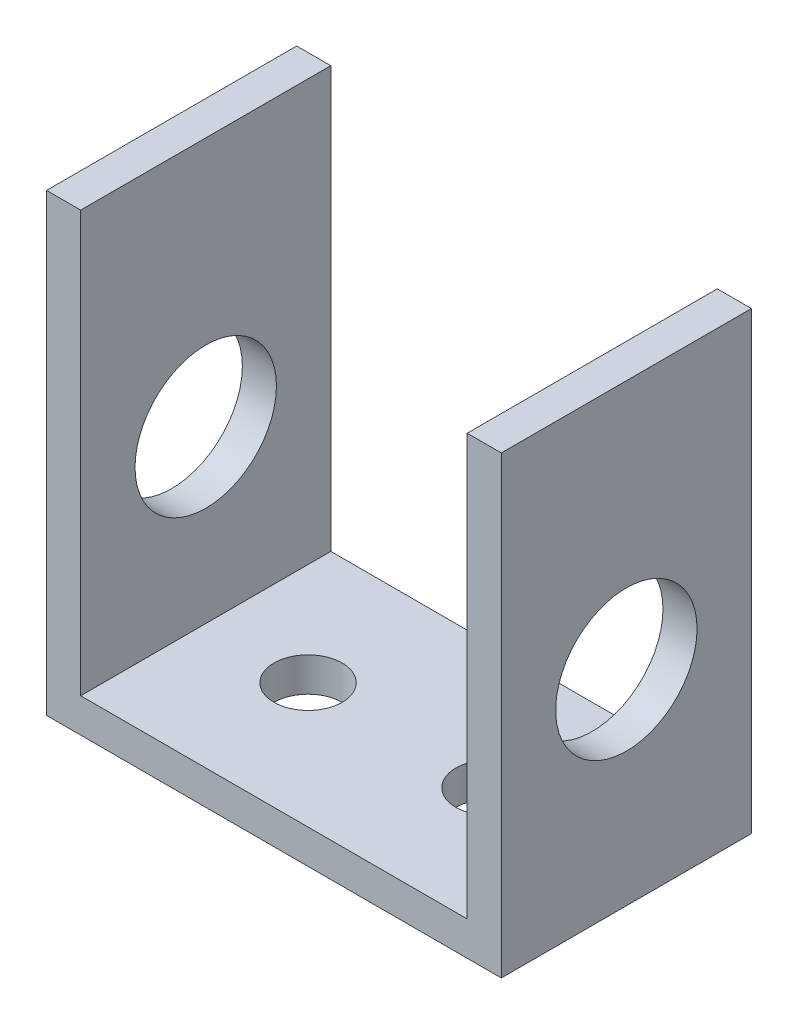
ISO-10303-21;
HEADER;
FILE_DESCRIPTION(('STEP AP214'),'2;1');
FILE_NAME('part.step','',(''),(''),'','','');
FILE_SCHEMA(('AUTOMOTIVE_DESIGN { 1 0 10303 214 1 1 1 1 }'));
ENDSEC;
DATA;
#1=APPLICATION_CONTEXT('core data for automotive mechanical design processes');
#2=APPLICATION_PROTOCOL_DEFINITION('international standard','automotive_design',2000,#1);
#3=PRODUCT_CONTEXT('',#1,'mechanical');
#4=PRODUCT('Part','Part','',(#3));
#5=PRODUCT_RELATED_PRODUCT_CATEGORY('part','',(#4));
#6=PRODUCT_DEFINITION_FORMATION('','',#4);
#7=PRODUCT_DEFINITION_CONTEXT('part definition',#1,'design');
#8=PRODUCT_DEFINITION('design','',#6,#7);
#9=PRODUCT_DEFINITION_SHAPE('','',#8);
#10=(LENGTH_UNIT() NAMED_UNIT(*) SI_UNIT(.MILLI.,.METRE.));
#11=(NAMED_UNIT(*) PLANE_ANGLE_UNIT() SI_UNIT($,.RADIAN.));
#12=(NAMED_UNIT(*) SI_UNIT($,.STERADIAN.) SOLID_ANGLE_UNIT());
#13=UNCERTAINTY_MEASURE_WITH_UNIT(LENGTH_MEASURE(1.E-05),#10,'distance_accuracy_value','');
#14=(GEOMETRIC_REPRESENTATION_CONTEXT(3) GLOBAL_UNCERTAINTY_ASSIGNED_CONTEXT((#13)) GLOBAL_UNIT_ASSIGNED_CONTEXT((#10,
#11,#12)) REPRESENTATION_CONTEXT('',''));
#15=CARTESIAN_POINT('',(0.,0.,0.));
#16=DIRECTION('',(0.,0.,1.));
#17=DIRECTION('',(1.,0.,0.));
#18=AXIS2_PLACEMENT_3D('',#15,#16,#17);
#19=CARTESIAN_POINT('',(-11.0947878242615,13.3137453891138,11.));
#20=DIRECTION('',(0.,-1.,0.));
#21=DIRECTION('',(0.,0.,-1.));
#22=AXIS2_PLACEMENT_3D('',#19,#20,#21);
#23=PLANE('',#22);
#24=DIRECTION('',(-1.,0.,0.));
#25=VECTOR('',#24,1.);
#26=CARTESIAN_POINT('',(-11.0947878242615,13.3137453891138,0.));
#27=LINE('',#26,#25);
#28=CARTESIAN_POINT('',(-9.59478782426151,13.3137453891138,0.));
#29=VERTEX_POINT('',#28);
#30=CARTESIAN_POINT('',(-11.0947878242615,13.3137453891138,0.));
#31=VERTEX_POINT('',#30);
#32=EDGE_CURVE('E127',#29,#31,#27,.T.);
#33=ORIENTED_EDGE('',*,*,#32,.T.);
#34=DIRECTION('',(0.,0.,-1.));
#35=VECTOR('',#34,1.);
#36=CARTESIAN_POINT('',(-11.0947878242615,13.3137453891138,11.));
#37=LINE('',#36,#35);
#38=CARTESIAN_POINT('',(-11.0947878242615,13.3137453891138,11.));
#39=VERTEX_POINT('',#38);
#40=EDGE_CURVE('E11',#39,#31,#37,.T.);
#41=ORIENTED_EDGE('',*,*,#40,.F.);
#42=DIRECTION('',(-1.,0.,0.));
#43=VECTOR('',#42,1.);
#44=CARTESIAN_POINT('',(-11.0947878242615,13.3137453891138,11.));
#45=LINE('',#44,#43);
#46=CARTESIAN_POINT('',(-9.59478782426151,13.3137453891138,11.));
#47=VERTEX_POINT('',#46);
#48=EDGE_CURVE('E142',#47,#39,#45,.T.);
#49=ORIENTED_EDGE('',*,*,#48,.F.);
#50=DIRECTION('',(0.,0.,-1.));
#51=VECTOR('',#50,1.);
#52=CARTESIAN_POINT('',(-9.59478782426151,13.3137453891138,11.));
#53=LINE('',#52,#51);
#54=EDGE_CURVE('E123',#47,#29,#53,.T.);
#55=ORIENTED_EDGE('',*,*,#54,.T.);
#56=EDGE_LOOP('',(#33,#41,#49,#55));
#57=FACE_BOUND('',#56,.T.);
#58=ADVANCED_FACE('F30',(#57),#23,.F.);
#59=CARTESIAN_POINT('',(-11.0947878242615,-6.68625461088619,11.));
#60=DIRECTION('',(1.,0.,0.));
#61=DIRECTION('',(0.,0.,-1.));
#62=AXIS2_PLACEMENT_3D('',#59,#60,#61);
#63=PLANE('',#62);
#64=CARTESIAN_POINT('',(-11.0947878242615,2.31374538911381,5.5));
#65=DIRECTION('',(1.,0.,0.));
#66=DIRECTION('',(0.,0.,-1.));
#67=AXIS2_PLACEMENT_3D('',#64,#65,#66);
#68=CIRCLE('',#67,3.11);
#69=CARTESIAN_POINT('',(-11.0947878242615,2.31374538911381,2.39));
#70=VERTEX_POINT('',#69);
#71=EDGE_CURVE('E181',#70,#70,#68,.T.);
#72=ORIENTED_EDGE('',*,*,#71,.T.);
#73=EDGE_LOOP('',(#72));
#74=FACE_BOUND('',#73,.T.);
#75=DIRECTION('',(0.,-1.,0.));
#76=VECTOR('',#75,1.);
#77=CARTESIAN_POINT('',(-11.0947878242615,-6.68625461088619,0.));
#78=LINE('',#77,#76);
#79=CARTESIAN_POINT('',(-11.0947878242615,-6.68625461088619,0.));
#80=VERTEX_POINT('',#79);
#81=EDGE_CURVE('E130',#31,#80,#78,.T.);
#82=ORIENTED_EDGE('',*,*,#81,.T.);
#83=DIRECTION('',(0.,0.,-1.));
#84=VECTOR('',#83,1.);
#85=CARTESIAN_POINT('',(-11.0947878242615,-6.68625461088619,11.));
#86=LINE('',#85,#84);
#87=CARTESIAN_POINT('',(-11.0947878242615,-6.68625461088619,11.));
#88=VERTEX_POINT('',#87);
#89=EDGE_CURVE('E39',#88,#80,#86,.T.);
#90=ORIENTED_EDGE('',*,*,#89,.F.);
#91=DIRECTION('',(0.,-1.,0.));
#92=VECTOR('',#91,1.);
#93=CARTESIAN_POINT('',(-11.0947878242615,-6.68625461088619,11.));
#94=LINE('',#93,#92);
#95=EDGE_CURVE('E90',#39,#88,#94,.T.);
#96=ORIENTED_EDGE('',*,*,#95,.F.);
#97=ORIENTED_EDGE('',*,*,#40,.T.);
#98=EDGE_LOOP('',(#82,#90,#96,#97));
#99=FACE_BOUND('',#98,.T.);
#100=ADVANCED_FACE('F214',(#74,#99),#63,.F.);
#101=CARTESIAN_POINT('',(-11.0947878242615,-6.68625461088619,11.));
#102=DIRECTION('',(0.,1.,0.));
#103=DIRECTION('',(0.,0.,1.));
#104=AXIS2_PLACEMENT_3D('',#101,#102,#103);
#105=PLANE('',#104);
#106=CARTESIAN_POINT('',(2.90521217573849,-6.68625461088619,5.5));
#107=DIRECTION('',(0.,1.,0.));
#108=DIRECTION('',(0.,0.,1.));
#109=AXIS2_PLACEMENT_3D('',#106,#107,#108);
#110=CIRCLE('',#109,1.5);
#111=CARTESIAN_POINT('',(2.90521217573849,-6.68625461088619,7.));
#112=VERTEX_POINT('',#111);
#113=EDGE_CURVE('E190',#112,#112,#110,.T.);
#114=ORIENTED_EDGE('',*,*,#113,.T.);
#115=EDGE_LOOP('',(#114));
#116=FACE_BOUND('',#115,.T.);
#117=CARTESIAN_POINT('',(-5.09478782426151,-6.68625461088619,5.5));
#118=DIRECTION('',(0.,1.,0.));
#119=DIRECTION('',(0.,0.,1.));
#120=AXIS2_PLACEMENT_3D('',#117,#118,#119);
#121=CIRCLE('',#120,1.5);
#122=CARTESIAN_POINT('',(-5.09478782426151,-6.68625461088619,7.));
#123=VERTEX_POINT('',#122);
#124=EDGE_CURVE('E182',#123,#123,#121,.T.);
#125=ORIENTED_EDGE('',*,*,#124,.T.);
#126=EDGE_LOOP('',(#125));
#127=FACE_BOUND('',#126,.T.);
#128=DIRECTION('',(1.,0.,0.));
#129=VECTOR('',#128,1.);
#130=CARTESIAN_POINT('',(-11.0947878242615,-6.68625461088619,0.));
#131=LINE('',#130,#129);
#132=CARTESIAN_POINT('',(8.90521217573849,-6.68625461088619,0.));
#133=VERTEX_POINT('',#132);
#134=EDGE_CURVE('E133',#80,#133,#131,.T.);
#135=ORIENTED_EDGE('',*,*,#134,.T.);
#136=DIRECTION('',(0.,0.,-1.));
#137=VECTOR('',#136,1.);
#138=CARTESIAN_POINT('',(8.90521217573849,-6.68625461088619,11.));
#139=LINE('',#138,#137);
#140=CARTESIAN_POINT('',(8.90521217573849,-6.68625461088619,11.));
#141=VERTEX_POINT('',#140);
#142=EDGE_CURVE('E149',#141,#133,#139,.T.);
#143=ORIENTED_EDGE('',*,*,#142,.F.);
#144=DIRECTION('',(1.,0.,0.));
#145=VECTOR('',#144,1.);
#146=CARTESIAN_POINT('',(-11.0947878242615,-6.68625461088619,11.));
#147=LINE('',#146,#145);
#148=EDGE_CURVE('E158',#88,#141,#147,.T.);
#149=ORIENTED_EDGE('',*,*,#148,.F.);
#150=ORIENTED_EDGE('',*,*,#89,.T.);
#151=EDGE_LOOP('',(#135,#143,#149,#150));
#152=FACE_BOUND('',#151,.T.);
#153=ADVANCED_FACE('F156',(#116,#127,#152),#105,.F.);
#154=CARTESIAN_POINT('',(8.90521217573849,-6.68625461088619,11.));
#155=DIRECTION('',(-1.,0.,0.));
#156=DIRECTION('',(0.,0.,1.));
#157=AXIS2_PLACEMENT_3D('',#154,#155,#156);
#158=PLANE('',#157);
#159=CARTESIAN_POINT('',(8.90521217573849,2.31374538911381,5.5));
#160=DIRECTION('',(1.,0.,0.));
#161=DIRECTION('',(0.,0.,-1.));
#162=AXIS2_PLACEMENT_3D('',#159,#160,#161);
#163=CIRCLE('',#162,3.11);
#164=CARTESIAN_POINT('',(8.90521217573849,2.31374538911381,2.39));
#165=VERTEX_POINT('',#164);
#166=EDGE_CURVE('E178',#165,#165,#163,.T.);
#167=ORIENTED_EDGE('',*,*,#166,.F.);
#168=EDGE_LOOP('',(#167));
#169=FACE_BOUND('',#168,.T.);
#170=DIRECTION('',(0.,1.,0.));
#171=VECTOR('',#170,1.);
#172=CARTESIAN_POINT('',(8.90521217573849,-6.68625461088619,0.));
#173=LINE('',#172,#171);
#174=CARTESIAN_POINT('',(8.90521217573849,13.3137453891138,0.));
#175=VERTEX_POINT('',#174);
#176=EDGE_CURVE('E135',#133,#175,#173,.T.);
#177=ORIENTED_EDGE('',*,*,#176,.T.);
#178=DIRECTION('',(0.,0.,-1.));
#179=VECTOR('',#178,1.);
#180=CARTESIAN_POINT('',(8.90521217573849,13.3137453891138,11.));
#181=LINE('',#180,#179);
#182=CARTESIAN_POINT('',(8.90521217573849,13.3137453891138,11.));
#183=VERTEX_POINT('',#182);
#184=EDGE_CURVE('E146',#183,#175,#181,.T.);
#185=ORIENTED_EDGE('',*,*,#184,.F.);
#186=DIRECTION('',(0.,1.,0.));
#187=VECTOR('',#186,1.);
#188=CARTESIAN_POINT('',(8.90521217573849,-6.68625461088619,11.));
#189=LINE('',#188,#187);
#190=EDGE_CURVE('E170',#141,#183,#189,.T.);
#191=ORIENTED_EDGE('',*,*,#190,.F.);
#192=ORIENTED_EDGE('',*,*,#142,.T.);
#193=EDGE_LOOP('',(#177,#185,#191,#192));
#194=FACE_BOUND('',#193,.T.);
#195=ADVANCED_FACE('F166',(#169,#194),#158,.F.);
#196=CARTESIAN_POINT('',(8.90521217573849,13.3137453891138,11.));
#197=DIRECTION('',(0.,-1.,0.));
#198=DIRECTION('',(0.,0.,-1.));
#199=AXIS2_PLACEMENT_3D('',#196,#197,#198);
#200=PLANE('',#199);
#201=DIRECTION('',(-1.,0.,0.));
#202=VECTOR('',#201,1.);
#203=CARTESIAN_POINT('',(8.90521217573849,13.3137453891138,0.));
#204=LINE('',#203,#202);
#205=CARTESIAN_POINT('',(7.40521217573849,13.3137453891138,0.));
#206=VERTEX_POINT('',#205);
#207=EDGE_CURVE('E137',#175,#206,#204,.T.);
#208=ORIENTED_EDGE('',*,*,#207,.T.);
#209=DIRECTION('',(0.,0.,-1.));
#210=VECTOR('',#209,1.);
#211=CARTESIAN_POINT('',(7.40521217573849,13.3137453891138,11.));
#212=LINE('',#211,#210);
#213=CARTESIAN_POINT('',(7.40521217573849,13.3137453891138,11.));
#214=VERTEX_POINT('',#213);
#215=EDGE_CURVE('E118',#214,#206,#212,.T.);
#216=ORIENTED_EDGE('',*,*,#215,.F.);
#217=DIRECTION('',(-1.,0.,0.));
#218=VECTOR('',#217,1.);
#219=CARTESIAN_POINT('',(8.90521217573849,13.3137453891138,11.));
#220=LINE('',#219,#218);
#221=EDGE_CURVE('E109',#183,#214,#220,.T.);
#222=ORIENTED_EDGE('',*,*,#221,.F.);
#223=ORIENTED_EDGE('',*,*,#184,.T.);
#224=EDGE_LOOP('',(#208,#216,#222,#223));
#225=FACE_BOUND('',#224,.T.);
#226=ADVANCED_FACE('F169',(#225),#200,.F.);
#227=CARTESIAN_POINT('',(7.40521217573849,13.3137453891138,11.));
#228=DIRECTION('',(1.,0.,0.));
#229=DIRECTION('',(0.,1.,0.));
#230=AXIS2_PLACEMENT_3D('',#227,#228,#229);
#231=PLANE('',#230);
#232=CARTESIAN_POINT('',(7.40521217573849,2.31374538911381,5.5));
#233=DIRECTION('',(1.,0.,0.));
#234=DIRECTION('',(0.,1.,0.));
#235=AXIS2_PLACEMENT_3D('',#232,#233,#234);
#236=CIRCLE('',#235,3.11);
#237=CARTESIAN_POINT('',(7.40521217573849,5.42374538911381,5.5));
#238=VERTEX_POINT('',#237);
#239=EDGE_CURVE('E131',#238,#238,#236,.T.);
#240=ORIENTED_EDGE('',*,*,#239,.T.);
#241=EDGE_LOOP('',(#240));
#242=FACE_BOUND('',#241,.T.);
#243=DIRECTION('',(0.,-1.,0.));
#244=VECTOR('',#243,1.);
#245=CARTESIAN_POINT('',(7.40521217573849,13.3137453891138,0.));
#246=LINE('',#245,#244);
#247=CARTESIAN_POINT('',(7.40521217573849,-5.18625461088619,0.));
#248=VERTEX_POINT('',#247);
#249=EDGE_CURVE('E117',#206,#248,#246,.T.);
#250=ORIENTED_EDGE('',*,*,#249,.T.);
#251=DIRECTION('',(0.,0.,-1.));
#252=VECTOR('',#251,1.);
#253=CARTESIAN_POINT('',(7.40521217573849,-5.18625461088619,11.));
#254=LINE('',#253,#252);
#255=CARTESIAN_POINT('',(7.40521217573849,-5.18625461088619,11.));
#256=VERTEX_POINT('',#255);
#257=EDGE_CURVE('E114',#256,#248,#254,.T.);
#258=ORIENTED_EDGE('',*,*,#257,.F.);
#259=DIRECTION('',(0.,-1.,0.));
#260=VECTOR('',#259,1.);
#261=CARTESIAN_POINT('',(7.40521217573849,13.3137453891138,11.));
#262=LINE('',#261,#260);
#263=EDGE_CURVE('E103',#214,#256,#262,.T.);
#264=ORIENTED_EDGE('',*,*,#263,.F.);
#265=ORIENTED_EDGE('',*,*,#215,.T.);
#266=EDGE_LOOP('',(#250,#258,#264,#265));
#267=FACE_BOUND('',#266,.T.);
#268=ADVANCED_FACE('F115',(#242,#267),#231,.F.);
#269=CARTESIAN_POINT('',(7.40521217573849,-5.18625461088619,11.));
#270=DIRECTION('',(0.,-1.,0.));
#271=DIRECTION('',(1.,0.,0.));
#272=AXIS2_PLACEMENT_3D('',#269,#270,#271);
#273=PLANE('',#272);
#274=CARTESIAN_POINT('',(2.90521217573849,-5.18625461088619,5.5));
#275=DIRECTION('',(0.,1.,0.));
#276=DIRECTION('',(0.,0.,1.));
#277=AXIS2_PLACEMENT_3D('',#274,#275,#276);
#278=CIRCLE('',#277,1.5);
#279=CARTESIAN_POINT('',(2.90521217573849,-5.18625461088619,7.));
#280=VERTEX_POINT('',#279);
#281=EDGE_CURVE('E193',#280,#280,#278,.T.);
#282=ORIENTED_EDGE('',*,*,#281,.F.);
#283=EDGE_LOOP('',(#282));
#284=FACE_BOUND('',#283,.T.);
#285=CARTESIAN_POINT('',(-5.09478782426151,-5.18625461088619,5.5));
#286=DIRECTION('',(0.,1.,0.));
#287=DIRECTION('',(0.,0.,1.));
#288=AXIS2_PLACEMENT_3D('',#285,#286,#287);
#289=CIRCLE('',#288,1.5);
#290=CARTESIAN_POINT('',(-5.09478782426151,-5.18625461088619,7.));
#291=VERTEX_POINT('',#290);
#292=EDGE_CURVE('E187',#291,#291,#289,.T.);
#293=ORIENTED_EDGE('',*,*,#292,.F.);
#294=EDGE_LOOP('',(#293));
#295=FACE_BOUND('',#294,.T.);
#296=DIRECTION('',(-1.,0.,0.));
#297=VECTOR('',#296,1.);
#298=CARTESIAN_POINT('',(7.40521217573849,-5.18625461088619,0.));
#299=LINE('',#298,#297);
#300=CARTESIAN_POINT('',(-9.59478782426151,-5.18625461088619,0.));
#301=VERTEX_POINT('',#300);
#302=EDGE_CURVE('E76',#248,#301,#299,.T.);
#303=ORIENTED_EDGE('',*,*,#302,.T.);
#304=DIRECTION('',(0.,0.,-1.));
#305=VECTOR('',#304,1.);
#306=CARTESIAN_POINT('',(-9.59478782426151,-5.18625461088619,11.));
#307=LINE('',#306,#305);
#308=CARTESIAN_POINT('',(-9.59478782426151,-5.18625461088619,11.));
#309=VERTEX_POINT('',#308);
#310=EDGE_CURVE('E119',#309,#301,#307,.T.);
#311=ORIENTED_EDGE('',*,*,#310,.F.);
#312=DIRECTION('',(-1.,0.,0.));
#313=VECTOR('',#312,1.);
#314=CARTESIAN_POINT('',(7.40521217573849,-5.18625461088619,11.));
#315=LINE('',#314,#313);
#316=EDGE_CURVE('E107',#256,#309,#315,.T.);
#317=ORIENTED_EDGE('',*,*,#316,.F.);
#318=ORIENTED_EDGE('',*,*,#257,.T.);
#319=EDGE_LOOP('',(#303,#311,#317,#318));
#320=FACE_BOUND('',#319,.T.);
#321=ADVANCED_FACE('F121',(#284,#295,#320),#273,.F.);
#322=CARTESIAN_POINT('',(-9.59478782426151,13.3137453891138,11.));
#323=DIRECTION('',(-1.,0.,0.));
#324=DIRECTION('',(0.,0.,1.));
#325=AXIS2_PLACEMENT_3D('',#322,#323,#324);
#326=PLANE('',#325);
#327=CARTESIAN_POINT('',(-9.59478782426151,2.31374538911381,5.5));
#328=DIRECTION('',(-1.,0.,0.));
#329=DIRECTION('',(0.,0.,1.));
#330=AXIS2_PLACEMENT_3D('',#327,#328,#329);
#331=CIRCLE('',#330,3.11);
#332=CARTESIAN_POINT('',(-9.59478782426151,2.31374538911381,8.61));
#333=VERTEX_POINT('',#332);
#334=EDGE_CURVE('E33',#333,#333,#331,.T.);
#335=ORIENTED_EDGE('',*,*,#334,.T.);
#336=EDGE_LOOP('',(#335));
#337=FACE_BOUND('',#336,.T.);
#338=DIRECTION('',(0.,1.,0.));
#339=VECTOR('',#338,1.);
#340=CARTESIAN_POINT('',(-9.59478782426151,13.3137453891138,0.));
#341=LINE('',#340,#339);
#342=EDGE_CURVE('E82',#301,#29,#341,.T.);
#343=ORIENTED_EDGE('',*,*,#342,.T.);
#344=ORIENTED_EDGE('',*,*,#54,.F.);
#345=DIRECTION('',(0.,1.,0.));
#346=VECTOR('',#345,1.);
#347=CARTESIAN_POINT('',(-9.59478782426151,13.3137453891138,11.));
#348=LINE('',#347,#346);
#349=EDGE_CURVE('E47',#309,#47,#348,.T.);
#350=ORIENTED_EDGE('',*,*,#349,.F.);
#351=ORIENTED_EDGE('',*,*,#310,.T.);
#352=EDGE_LOOP('',(#343,#344,#350,#351));
#353=FACE_BOUND('',#352,.T.);
#354=ADVANCED_FACE('F202',(#337,#353),#326,.F.);
#355=CARTESIAN_POINT('',(-9.59478782426151,13.3137453891138,11.));
#356=DIRECTION('',(0.,0.,-1.));
#357=DIRECTION('',(-1.,0.,0.));
#358=AXIS2_PLACEMENT_3D('',#355,#356,#357);
#359=PLANE('',#358);
#360=ORIENTED_EDGE('',*,*,#48,.T.);
#361=ORIENTED_EDGE('',*,*,#95,.T.);
#362=ORIENTED_EDGE('',*,*,#148,.T.);
#363=ORIENTED_EDGE('',*,*,#190,.T.);
#364=ORIENTED_EDGE('',*,*,#221,.T.);
#365=ORIENTED_EDGE('',*,*,#263,.T.);
#366=ORIENTED_EDGE('',*,*,#316,.T.);
#367=ORIENTED_EDGE('',*,*,#349,.T.);
#368=EDGE_LOOP('',(#360,#361,#362,#363,#364,#365,#366,#367));
#369=FACE_BOUND('',#368,.T.);
#370=ADVANCED_FACE('F105',(#369),#359,.F.);
#371=CARTESIAN_POINT('',(-9.59478782426151,13.3137453891138,0.));
#372=DIRECTION('',(0.,0.,-1.));
#373=DIRECTION('',(-1.,0.,0.));
#374=AXIS2_PLACEMENT_3D('',#371,#372,#373);
#375=PLANE('',#374);
#376=ORIENTED_EDGE('',*,*,#32,.F.);
#377=ORIENTED_EDGE('',*,*,#342,.F.);
#378=ORIENTED_EDGE('',*,*,#302,.F.);
#379=ORIENTED_EDGE('',*,*,#249,.F.);
#380=ORIENTED_EDGE('',*,*,#207,.F.);
#381=ORIENTED_EDGE('',*,*,#176,.F.);
#382=ORIENTED_EDGE('',*,*,#134,.F.);
#383=ORIENTED_EDGE('',*,*,#81,.F.);
#384=EDGE_LOOP('',(#376,#377,#378,#379,#380,#381,#382,#383));
#385=FACE_BOUND('',#384,.T.);
#386=ADVANCED_FACE('F162',(#385),#375,.T.);
#387=CARTESIAN_POINT('',(-11.0947878242615,2.31374538911381,5.5));
#388=DIRECTION('',(1.,0.,0.));
#389=DIRECTION('',(0.,0.,-1.));
#390=AXIS2_PLACEMENT_3D('',#387,#388,#389);
#391=CYLINDRICAL_SURFACE('',#390,3.11);
#392=ORIENTED_EDGE('',*,*,#71,.F.);
#393=EDGE_LOOP('',(#392));
#394=FACE_BOUND('',#393,.T.);
#395=ORIENTED_EDGE('',*,*,#334,.F.);
#396=EDGE_LOOP('',(#395));
#397=FACE_BOUND('',#396,.T.);
#398=ADVANCED_FACE('F282',(#394,#397),#391,.F.);
#399=ORIENTED_EDGE('',*,*,#166,.T.);
#400=EDGE_LOOP('',(#399));
#401=FACE_BOUND('',#400,.T.);
#402=ORIENTED_EDGE('',*,*,#239,.F.);
#403=EDGE_LOOP('',(#402));
#404=FACE_BOUND('',#403,.T.);
#405=ADVANCED_FACE('F209',(#401,#404),#391,.F.);
#406=CARTESIAN_POINT('',(-5.09478782426151,-16.1862546108862,5.5));
#407=DIRECTION('',(0.,1.,0.));
#408=DIRECTION('',(0.,0.,1.));
#409=AXIS2_PLACEMENT_3D('',#406,#407,#408);
#410=CYLINDRICAL_SURFACE('',#409,1.5);
#411=ORIENTED_EDGE('',*,*,#292,.T.);
#412=EDGE_LOOP('',(#411));
#413=FACE_BOUND('',#412,.T.);
#414=ORIENTED_EDGE('',*,*,#124,.F.);
#415=EDGE_LOOP('',(#414));
#416=FACE_BOUND('',#415,.T.);
#417=ADVANCED_FACE('F206',(#413,#416),#410,.F.);
#418=CARTESIAN_POINT('',(2.90521217573849,-16.1862546108862,5.5));
#419=DIRECTION('',(0.,1.,0.));
#420=DIRECTION('',(0.,0.,1.));
#421=AXIS2_PLACEMENT_3D('',#418,#419,#420);
#422=CYLINDRICAL_SURFACE('',#421,1.5);
#423=ORIENTED_EDGE('',*,*,#281,.T.);
#424=EDGE_LOOP('',(#423));
#425=FACE_BOUND('',#424,.T.);
#426=ORIENTED_EDGE('',*,*,#113,.F.);
#427=EDGE_LOOP('',(#426));
#428=FACE_BOUND('',#427,.T.);
#429=ADVANCED_FACE('F197',(#425,#428),#422,.F.);
#430=CLOSED_SHELL('',(#58,#100,#153,#195,#226,#268,#321,#354,#370,#386,#398,#405,#417,#429));
#431=MANIFOLD_SOLID_BREP('B2',#430);
#432=ADVANCED_BREP_SHAPE_REPRESENTATION('',(#18,#431),#14);
#433=SHAPE_DEFINITION_REPRESENTATION(#9,#432);
ENDSEC;
END-ISO-10303-21;
